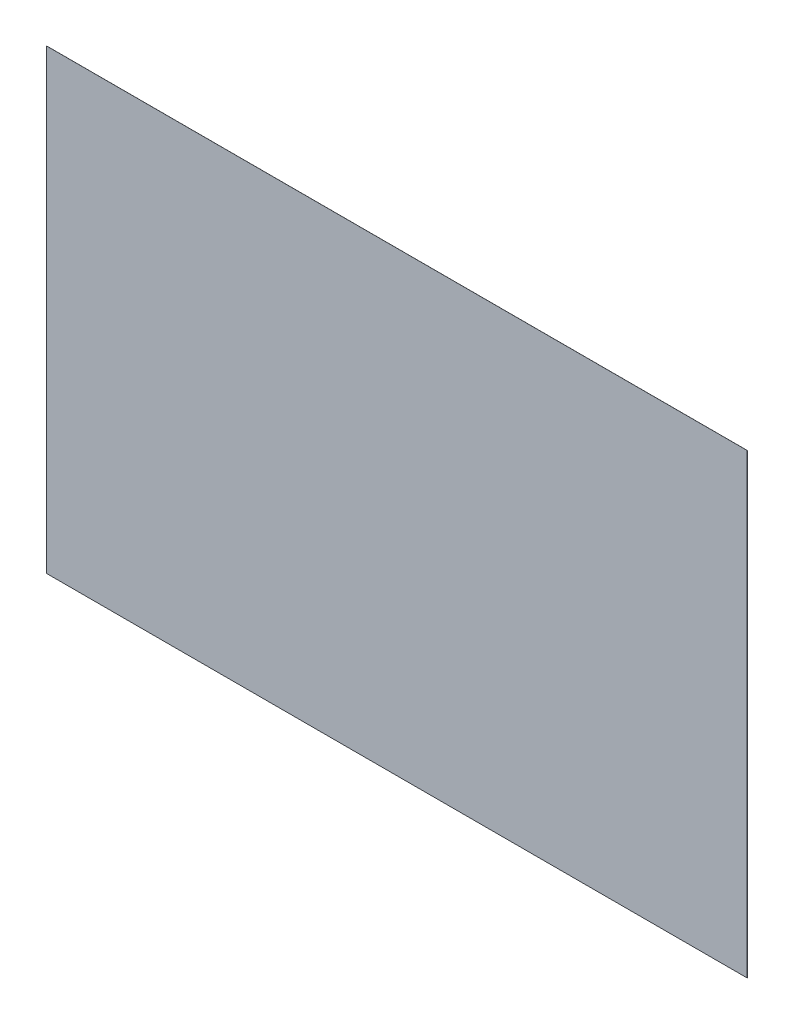
ISO-10303-21;
HEADER;
FILE_DESCRIPTION(('STEP AP214'),'2;1');
FILE_NAME('part.step','',(''),(''),'','','');
FILE_SCHEMA(('AUTOMOTIVE_DESIGN { 1 0 10303 214 1 1 1 1 }'));
ENDSEC;
DATA;
#1=APPLICATION_CONTEXT('core data for automotive mechanical design processes');
#2=APPLICATION_PROTOCOL_DEFINITION('international standard','automotive_design',2000,#1);
#3=PRODUCT_CONTEXT('',#1,'mechanical');
#4=PRODUCT('Part','Part','',(#3));
#5=PRODUCT_RELATED_PRODUCT_CATEGORY('part','',(#4));
#6=PRODUCT_DEFINITION_FORMATION('','',#4);
#7=PRODUCT_DEFINITION_CONTEXT('part definition',#1,'design');
#8=PRODUCT_DEFINITION('design','',#6,#7);
#9=PRODUCT_DEFINITION_SHAPE('','',#8);
#10=(LENGTH_UNIT() NAMED_UNIT(*) SI_UNIT(.MILLI.,.METRE.));
#11=(NAMED_UNIT(*) PLANE_ANGLE_UNIT() SI_UNIT($,.RADIAN.));
#12=(NAMED_UNIT(*) SI_UNIT($,.STERADIAN.) SOLID_ANGLE_UNIT());
#13=UNCERTAINTY_MEASURE_WITH_UNIT(LENGTH_MEASURE(1.E-05),#10,'distance_accuracy_value','');
#14=(GEOMETRIC_REPRESENTATION_CONTEXT(3) GLOBAL_UNCERTAINTY_ASSIGNED_CONTEXT((#13)) GLOBAL_UNIT_ASSIGNED_CONTEXT((#10,
#11,#12)) REPRESENTATION_CONTEXT('',''));
#15=CARTESIAN_POINT('',(0.,0.,0.));
#16=DIRECTION('',(0.,0.,1.));
#17=DIRECTION('',(1.,0.,0.));
#18=AXIS2_PLACEMENT_3D('',#15,#16,#17);
#19=CARTESIAN_POINT('',(287.5,187.5,0.026));
#20=DIRECTION('',(-1.,0.,0.));
#21=DIRECTION('',(0.,-1.,0.));
#22=AXIS2_PLACEMENT_3D('',#19,#20,#21);
#23=PLANE('',#22);
#24=DIRECTION('',(0.,1.,0.));
#25=VECTOR('',#24,1.);
#26=CARTESIAN_POINT('',(287.5,187.5,-0.026));
#27=LINE('',#26,#25);
#28=CARTESIAN_POINT('',(287.5,-187.5,-0.026));
#29=VERTEX_POINT('',#28);
#30=CARTESIAN_POINT('',(287.5,187.5,-0.026));
#31=VERTEX_POINT('',#30);
#32=EDGE_CURVE('E115',#29,#31,#27,.T.);
#33=ORIENTED_EDGE('',*,*,#32,.T.);
#34=DIRECTION('',(0.,0.,-1.));
#35=VECTOR('',#34,1.);
#36=CARTESIAN_POINT('',(287.5,187.5,0.026));
#37=LINE('',#36,#35);
#38=CARTESIAN_POINT('',(287.5,187.5,0.026));
#39=VERTEX_POINT('',#38);
#40=EDGE_CURVE('E11',#39,#31,#37,.T.);
#41=ORIENTED_EDGE('',*,*,#40,.F.);
#42=DIRECTION('',(0.,1.,0.));
#43=VECTOR('',#42,1.);
#44=CARTESIAN_POINT('',(287.5,187.5,0.026));
#45=LINE('',#44,#43);
#46=CARTESIAN_POINT('',(287.5,-187.5,0.026));
#47=VERTEX_POINT('',#46);
#48=EDGE_CURVE('E99',#47,#39,#45,.T.);
#49=ORIENTED_EDGE('',*,*,#48,.F.);
#50=DIRECTION('',(0.,0.,-1.));
#51=VECTOR('',#50,1.);
#52=CARTESIAN_POINT('',(287.5,-187.5,0.026));
#53=LINE('',#52,#51);
#54=EDGE_CURVE('E111',#47,#29,#53,.T.);
#55=ORIENTED_EDGE('',*,*,#54,.T.);
#56=EDGE_LOOP('',(#33,#41,#49,#55));
#57=FACE_BOUND('',#56,.T.);
#58=ADVANCED_FACE('F47',(#57),#23,.F.);
#59=CARTESIAN_POINT('',(-287.5,187.5,0.026));
#60=DIRECTION('',(0.,-1.,0.));
#61=DIRECTION('',(0.,0.,-1.));
#62=AXIS2_PLACEMENT_3D('',#59,#60,#61);
#63=PLANE('',#62);
#64=DIRECTION('',(-1.,0.,0.));
#65=VECTOR('',#64,1.);
#66=CARTESIAN_POINT('',(-287.5,187.5,-0.026));
#67=LINE('',#66,#65);
#68=CARTESIAN_POINT('',(-287.5,187.5,-0.026));
#69=VERTEX_POINT('',#68);
#70=EDGE_CURVE('E104',#31,#69,#67,.T.);
#71=ORIENTED_EDGE('',*,*,#70,.T.);
#72=DIRECTION('',(0.,0.,-1.));
#73=VECTOR('',#72,1.);
#74=CARTESIAN_POINT('',(-287.5,187.5,0.026));
#75=LINE('',#74,#73);
#76=CARTESIAN_POINT('',(-287.5,187.5,0.026));
#77=VERTEX_POINT('',#76);
#78=EDGE_CURVE('E56',#77,#69,#75,.T.);
#79=ORIENTED_EDGE('',*,*,#78,.F.);
#80=DIRECTION('',(-1.,0.,0.));
#81=VECTOR('',#80,1.);
#82=CARTESIAN_POINT('',(-287.5,187.5,0.026));
#83=LINE('',#82,#81);
#84=EDGE_CURVE('E94',#39,#77,#83,.T.);
#85=ORIENTED_EDGE('',*,*,#84,.F.);
#86=ORIENTED_EDGE('',*,*,#40,.T.);
#87=EDGE_LOOP('',(#71,#79,#85,#86));
#88=FACE_BOUND('',#87,.T.);
#89=ADVANCED_FACE('F103',(#88),#63,.F.);
#90=CARTESIAN_POINT('',(-287.5,187.5,0.026));
#91=DIRECTION('',(1.,0.,0.));
#92=DIRECTION('',(0.,1.,0.));
#93=AXIS2_PLACEMENT_3D('',#90,#91,#92);
#94=PLANE('',#93);
#95=DIRECTION('',(0.,-1.,0.));
#96=VECTOR('',#95,1.);
#97=CARTESIAN_POINT('',(-287.5,187.5,-0.026));
#98=LINE('',#97,#96);
#99=CARTESIAN_POINT('',(-287.5,-187.5,-0.026));
#100=VERTEX_POINT('',#99);
#101=EDGE_CURVE('E81',#69,#100,#98,.T.);
#102=ORIENTED_EDGE('',*,*,#101,.T.);
#103=DIRECTION('',(0.,0.,-1.));
#104=VECTOR('',#103,1.);
#105=CARTESIAN_POINT('',(-287.5,-187.5,0.026));
#106=LINE('',#105,#104);
#107=CARTESIAN_POINT('',(-287.5,-187.5,0.026));
#108=VERTEX_POINT('',#107);
#109=EDGE_CURVE('E106',#108,#100,#106,.T.);
#110=ORIENTED_EDGE('',*,*,#109,.F.);
#111=DIRECTION('',(0.,-1.,0.));
#112=VECTOR('',#111,1.);
#113=CARTESIAN_POINT('',(-287.5,187.5,0.026));
#114=LINE('',#113,#112);
#115=EDGE_CURVE('E97',#77,#108,#114,.T.);
#116=ORIENTED_EDGE('',*,*,#115,.F.);
#117=ORIENTED_EDGE('',*,*,#78,.T.);
#118=EDGE_LOOP('',(#102,#110,#116,#117));
#119=FACE_BOUND('',#118,.T.);
#120=ADVANCED_FACE('F107',(#119),#94,.F.);
#121=CARTESIAN_POINT('',(-287.5,-187.5,0.026));
#122=DIRECTION('',(0.,1.,0.));
#123=DIRECTION('',(0.,0.,1.));
#124=AXIS2_PLACEMENT_3D('',#121,#122,#123);
#125=PLANE('',#124);
#126=DIRECTION('',(1.,0.,0.));
#127=VECTOR('',#126,1.);
#128=CARTESIAN_POINT('',(-287.5,-187.5,-0.026));
#129=LINE('',#128,#127);
#130=EDGE_CURVE('E87',#100,#29,#129,.T.);
#131=ORIENTED_EDGE('',*,*,#130,.T.);
#132=ORIENTED_EDGE('',*,*,#54,.F.);
#133=DIRECTION('',(1.,0.,0.));
#134=VECTOR('',#133,1.);
#135=CARTESIAN_POINT('',(-287.5,-187.5,0.026));
#136=LINE('',#135,#134);
#137=EDGE_CURVE('E64',#108,#47,#136,.T.);
#138=ORIENTED_EDGE('',*,*,#137,.F.);
#139=ORIENTED_EDGE('',*,*,#109,.T.);
#140=EDGE_LOOP('',(#131,#132,#138,#139));
#141=FACE_BOUND('',#140,.T.);
#142=ADVANCED_FACE('F128',(#141),#125,.F.);
#143=CARTESIAN_POINT('',(0.,0.,0.026));
#144=DIRECTION('',(0.,0.,1.));
#145=DIRECTION('',(1.,0.,0.));
#146=AXIS2_PLACEMENT_3D('',#143,#144,#145);
#147=PLANE('',#146);
#148=ORIENTED_EDGE('',*,*,#48,.T.);
#149=ORIENTED_EDGE('',*,*,#84,.T.);
#150=ORIENTED_EDGE('',*,*,#115,.T.);
#151=ORIENTED_EDGE('',*,*,#137,.T.);
#152=EDGE_LOOP('',(#148,#149,#150,#151));
#153=FACE_BOUND('',#152,.T.);
#154=ADVANCED_FACE('F95',(#153),#147,.T.);
#155=CARTESIAN_POINT('',(0.,0.,-0.026));
#156=DIRECTION('',(0.,0.,1.));
#157=DIRECTION('',(1.,0.,0.));
#158=AXIS2_PLACEMENT_3D('',#155,#156,#157);
#159=PLANE('',#158);
#160=ORIENTED_EDGE('',*,*,#32,.F.);
#161=ORIENTED_EDGE('',*,*,#130,.F.);
#162=ORIENTED_EDGE('',*,*,#101,.F.);
#163=ORIENTED_EDGE('',*,*,#70,.F.);
#164=EDGE_LOOP('',(#160,#161,#162,#163));
#165=FACE_BOUND('',#164,.T.);
#166=ADVANCED_FACE('F131',(#165),#159,.F.);
#167=CLOSED_SHELL('',(#58,#89,#120,#142,#154,#166));
#168=MANIFOLD_SOLID_BREP('B2',#167);
#169=ADVANCED_BREP_SHAPE_REPRESENTATION('',(#18,#168),#14);
#170=SHAPE_DEFINITION_REPRESENTATION(#9,#169);
ENDSEC;
END-ISO-10303-21;
